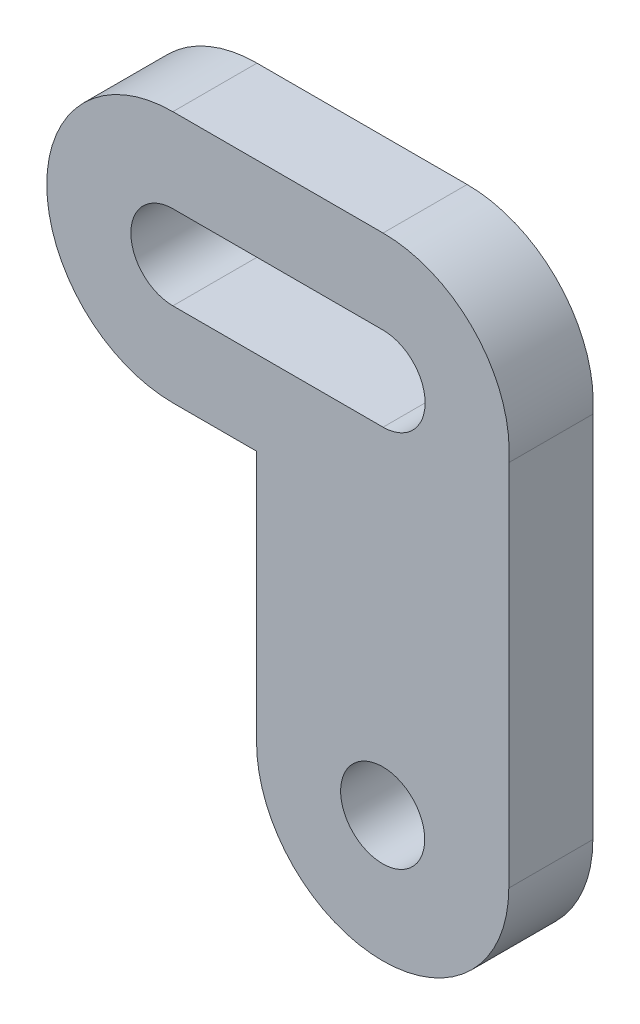
ISO-10303-21;
HEADER;
FILE_DESCRIPTION(('STEP AP214'),'2;1');
FILE_NAME('part.step','',(''),(''),'','','');
FILE_SCHEMA(('AUTOMOTIVE_DESIGN { 1 0 10303 214 1 1 1 1 }'));
ENDSEC;
DATA;
#1=APPLICATION_CONTEXT('core data for automotive mechanical design processes');
#2=APPLICATION_PROTOCOL_DEFINITION('international standard','automotive_design',2000,#1);
#3=PRODUCT_CONTEXT('',#1,'mechanical');
#4=PRODUCT('Part','Part','',(#3));
#5=PRODUCT_RELATED_PRODUCT_CATEGORY('part','',(#4));
#6=PRODUCT_DEFINITION_FORMATION('','',#4);
#7=PRODUCT_DEFINITION_CONTEXT('part definition',#1,'design');
#8=PRODUCT_DEFINITION('design','',#6,#7);
#9=PRODUCT_DEFINITION_SHAPE('','',#8);
#10=(LENGTH_UNIT() NAMED_UNIT(*) SI_UNIT(.MILLI.,.METRE.));
#11=(NAMED_UNIT(*) PLANE_ANGLE_UNIT() SI_UNIT($,.RADIAN.));
#12=(NAMED_UNIT(*) SI_UNIT($,.STERADIAN.) SOLID_ANGLE_UNIT());
#13=UNCERTAINTY_MEASURE_WITH_UNIT(LENGTH_MEASURE(1.E-05),#10,'distance_accuracy_value','');
#14=(GEOMETRIC_REPRESENTATION_CONTEXT(3) GLOBAL_UNCERTAINTY_ASSIGNED_CONTEXT((#13)) GLOBAL_UNIT_ASSIGNED_CONTEXT((#10,
#11,#12)) REPRESENTATION_CONTEXT('',''));
#15=CARTESIAN_POINT('',(0.,0.,0.));
#16=DIRECTION('',(0.,0.,1.));
#17=DIRECTION('',(1.,0.,0.));
#18=AXIS2_PLACEMENT_3D('',#15,#16,#17);
#19=CARTESIAN_POINT('',(156.2128865511,239.8700734832,3.));
#20=DIRECTION('',(0.,0.,-1.));
#21=DIRECTION('',(-1.,0.,0.));
#22=AXIS2_PLACEMENT_3D('',#19,#20,#21);
#23=CYLINDRICAL_SURFACE('',#22,1.5);
#24=CARTESIAN_POINT('',(156.2128865511,239.8700734832,0.));
#25=DIRECTION('',(0.,0.,1.));
#26=DIRECTION('',(1.,0.,0.));
#27=AXIS2_PLACEMENT_3D('',#24,#25,#26);
#28=CIRCLE('',#27,1.5);
#29=CARTESIAN_POINT('',(156.2128865511,238.3700734832,0.));
#30=VERTEX_POINT('',#29);
#31=CARTESIAN_POINT('',(156.2128865511,241.3700734832,0.));
#32=VERTEX_POINT('',#31);
#33=EDGE_CURVE('E172',#30,#32,#28,.T.);
#34=ORIENTED_EDGE('',*,*,#33,.F.);
#35=DIRECTION('',(0.,0.,-1.));
#36=VECTOR('',#35,1.);
#37=CARTESIAN_POINT('',(156.2128865511,238.3700734832,3.));
#38=LINE('',#37,#36);
#39=CARTESIAN_POINT('',(156.2128865511,238.3700734832,3.));
#40=VERTEX_POINT('',#39);
#41=EDGE_CURVE('E11',#40,#30,#38,.T.);
#42=ORIENTED_EDGE('',*,*,#41,.F.);
#43=CARTESIAN_POINT('',(156.2128865511,239.8700734832,3.));
#44=DIRECTION('',(0.,0.,1.));
#45=DIRECTION('',(1.,0.,0.));
#46=AXIS2_PLACEMENT_3D('',#43,#44,#45);
#47=CIRCLE('',#46,1.5);
#48=CARTESIAN_POINT('',(156.2128865511,241.3700734832,3.));
#49=VERTEX_POINT('',#48);
#50=EDGE_CURVE('E131',#40,#49,#47,.T.);
#51=ORIENTED_EDGE('',*,*,#50,.T.);
#52=DIRECTION('',(0.,0.,-1.));
#53=VECTOR('',#52,1.);
#54=CARTESIAN_POINT('',(156.2128865511,241.3700734832,3.));
#55=LINE('',#54,#53);
#56=EDGE_CURVE('E95',#49,#32,#55,.T.);
#57=ORIENTED_EDGE('',*,*,#56,.T.);
#58=EDGE_LOOP('',(#34,#42,#51,#57));
#59=FACE_BOUND('',#58,.T.);
#60=ADVANCED_FACE('F33',(#59),#23,.F.);
#61=CARTESIAN_POINT('',(0.,238.3700734832,3.));
#62=DIRECTION('',(0.,-1.,0.));
#63=DIRECTION('',(0.,0.,-1.));
#64=AXIS2_PLACEMENT_3D('',#61,#62,#63);
#65=PLANE('',#64);
#66=DIRECTION('',(-1.,0.,0.));
#67=VECTOR('',#66,1.);
#68=CARTESIAN_POINT('',(0.,238.3700734832,0.));
#69=LINE('',#68,#67);
#70=CARTESIAN_POINT('',(148.7128865511,238.3700734832,0.));
#71=VERTEX_POINT('',#70);
#72=EDGE_CURVE('E137',#30,#71,#69,.T.);
#73=ORIENTED_EDGE('',*,*,#72,.T.);
#74=DIRECTION('',(0.,0.,-1.));
#75=VECTOR('',#74,1.);
#76=CARTESIAN_POINT('',(148.7128865511,238.3700734832,3.));
#77=LINE('',#76,#75);
#78=CARTESIAN_POINT('',(148.7128865511,238.3700734832,3.));
#79=VERTEX_POINT('',#78);
#80=EDGE_CURVE('E43',#79,#71,#77,.T.);
#81=ORIENTED_EDGE('',*,*,#80,.F.);
#82=DIRECTION('',(-1.,0.,0.));
#83=VECTOR('',#82,1.);
#84=CARTESIAN_POINT('',(0.,238.3700734832,3.));
#85=LINE('',#84,#83);
#86=EDGE_CURVE('E125',#40,#79,#85,.T.);
#87=ORIENTED_EDGE('',*,*,#86,.F.);
#88=ORIENTED_EDGE('',*,*,#41,.T.);
#89=EDGE_LOOP('',(#73,#81,#87,#88));
#90=FACE_BOUND('',#89,.T.);
#91=ADVANCED_FACE('F135',(#90),#65,.F.);
#92=CARTESIAN_POINT('',(148.7128865511,239.8700734832,3.));
#93=DIRECTION('',(0.,0.,-1.));
#94=DIRECTION('',(-1.,0.,0.));
#95=AXIS2_PLACEMENT_3D('',#92,#93,#94);
#96=CYLINDRICAL_SURFACE('',#95,1.5);
#97=CARTESIAN_POINT('',(148.7128865511,239.8700734832,0.));
#98=DIRECTION('',(0.,0.,1.));
#99=DIRECTION('',(1.,0.,0.));
#100=AXIS2_PLACEMENT_3D('',#97,#98,#99);
#101=CIRCLE('',#100,1.5);
#102=CARTESIAN_POINT('',(148.7128865511,241.3700734832,0.));
#103=VERTEX_POINT('',#102);
#104=EDGE_CURVE('E176',#103,#71,#101,.T.);
#105=ORIENTED_EDGE('',*,*,#104,.F.);
#106=DIRECTION('',(0.,0.,-1.));
#107=VECTOR('',#106,1.);
#108=CARTESIAN_POINT('',(148.7128865511,241.3700734832,3.));
#109=LINE('',#108,#107);
#110=CARTESIAN_POINT('',(148.7128865511,241.3700734832,3.));
#111=VERTEX_POINT('',#110);
#112=EDGE_CURVE('E88',#111,#103,#109,.T.);
#113=ORIENTED_EDGE('',*,*,#112,.F.);
#114=CARTESIAN_POINT('',(148.7128865511,239.8700734832,3.));
#115=DIRECTION('',(0.,0.,1.));
#116=DIRECTION('',(1.,0.,0.));
#117=AXIS2_PLACEMENT_3D('',#114,#115,#116);
#118=CIRCLE('',#117,1.5);
#119=EDGE_CURVE('E130',#111,#79,#118,.T.);
#120=ORIENTED_EDGE('',*,*,#119,.T.);
#121=ORIENTED_EDGE('',*,*,#80,.T.);
#122=EDGE_LOOP('',(#105,#113,#120,#121));
#123=FACE_BOUND('',#122,.T.);
#124=ADVANCED_FACE('F142',(#123),#96,.F.);
#125=CARTESIAN_POINT('',(160.6989262173,0.,3.));
#126=DIRECTION('',(1.,0.,0.));
#127=DIRECTION('',(0.,0.,-1.));
#128=AXIS2_PLACEMENT_3D('',#125,#126,#127);
#129=PLANE('',#128);
#130=DIRECTION('',(0.,-1.,0.));
#131=VECTOR('',#130,1.);
#132=CARTESIAN_POINT('',(160.6989262173,0.,0.));
#133=LINE('',#132,#131);
#134=CARTESIAN_POINT('',(160.6989262173,239.515886931676,0.));
#135=VERTEX_POINT('',#134);
#136=CARTESIAN_POINT('',(160.6989262173,226.3700734832,0.));
#137=VERTEX_POINT('',#136);
#138=EDGE_CURVE('E151',#135,#137,#133,.T.);
#139=ORIENTED_EDGE('',*,*,#138,.F.);
#140=DIRECTION('',(0.,0.,-1.));
#141=VECTOR('',#140,1.);
#142=CARTESIAN_POINT('',(160.6989262173,239.515886931676,3.));
#143=LINE('',#142,#141);
#144=CARTESIAN_POINT('',(160.6989262173,239.515886931676,3.));
#145=VERTEX_POINT('',#144);
#146=EDGE_CURVE('E37',#145,#135,#143,.T.);
#147=ORIENTED_EDGE('',*,*,#146,.F.);
#148=DIRECTION('',(0.,-1.,0.));
#149=VECTOR('',#148,1.);
#150=CARTESIAN_POINT('',(160.6989262173,0.,3.));
#151=LINE('',#150,#149);
#152=CARTESIAN_POINT('',(160.6989262173,226.3700734832,3.));
#153=VERTEX_POINT('',#152);
#154=EDGE_CURVE('E183',#145,#153,#151,.T.);
#155=ORIENTED_EDGE('',*,*,#154,.T.);
#156=DIRECTION('',(0.,0.,-1.));
#157=VECTOR('',#156,1.);
#158=CARTESIAN_POINT('',(160.6989262173,226.3700734832,3.));
#159=LINE('',#158,#157);
#160=EDGE_CURVE('E150',#153,#137,#159,.T.);
#161=ORIENTED_EDGE('',*,*,#160,.T.);
#162=EDGE_LOOP('',(#139,#147,#155,#161));
#163=FACE_BOUND('',#162,.T.);
#164=ADVANCED_FACE('F35',(#163),#129,.T.);
#165=CARTESIAN_POINT('',(156.2128865511,239.8700734832,3.));
#166=DIRECTION('',(0.,0.,-1.));
#167=DIRECTION('',(-1.,0.,0.));
#168=AXIS2_PLACEMENT_3D('',#165,#166,#167);
#169=CYLINDRICAL_SURFACE('',#168,4.5);
#170=CARTESIAN_POINT('',(156.2128865511,239.8700734832,0.));
#171=DIRECTION('',(0.,0.,1.));
#172=DIRECTION('',(1.,0.,0.));
#173=AXIS2_PLACEMENT_3D('',#170,#171,#172);
#174=CIRCLE('',#173,4.5);
#175=CARTESIAN_POINT('',(156.2128865511,244.3700734832,0.));
#176=VERTEX_POINT('',#175);
#177=EDGE_CURVE('E154',#135,#176,#174,.T.);
#178=ORIENTED_EDGE('',*,*,#177,.T.);
#179=DIRECTION('',(0.,0.,-1.));
#180=VECTOR('',#179,1.);
#181=CARTESIAN_POINT('',(156.2128865511,244.3700734832,3.));
#182=LINE('',#181,#180);
#183=CARTESIAN_POINT('',(156.2128865511,244.3700734832,3.));
#184=VERTEX_POINT('',#183);
#185=EDGE_CURVE('E194',#184,#176,#182,.T.);
#186=ORIENTED_EDGE('',*,*,#185,.F.);
#187=CARTESIAN_POINT('',(156.2128865511,239.8700734832,3.));
#188=DIRECTION('',(0.,0.,1.));
#189=DIRECTION('',(1.,0.,0.));
#190=AXIS2_PLACEMENT_3D('',#187,#188,#189);
#191=CIRCLE('',#190,4.5);
#192=EDGE_CURVE('E202',#145,#184,#191,.T.);
#193=ORIENTED_EDGE('',*,*,#192,.F.);
#194=ORIENTED_EDGE('',*,*,#146,.T.);
#195=EDGE_LOOP('',(#178,#186,#193,#194));
#196=FACE_BOUND('',#195,.T.);
#197=ADVANCED_FACE('F201',(#196),#169,.T.);
#198=CARTESIAN_POINT('',(0.,244.3700734832,3.));
#199=DIRECTION('',(0.,1.,0.));
#200=DIRECTION('',(0.,0.,1.));
#201=AXIS2_PLACEMENT_3D('',#198,#199,#200);
#202=PLANE('',#201);
#203=DIRECTION('',(1.,0.,0.));
#204=VECTOR('',#203,1.);
#205=CARTESIAN_POINT('',(0.,244.3700734832,0.));
#206=LINE('',#205,#204);
#207=CARTESIAN_POINT('',(148.7128865511,244.3700734832,0.));
#208=VERTEX_POINT('',#207);
#209=EDGE_CURVE('E157',#208,#176,#206,.T.);
#210=ORIENTED_EDGE('',*,*,#209,.F.);
#211=DIRECTION('',(0.,0.,-1.));
#212=VECTOR('',#211,1.);
#213=CARTESIAN_POINT('',(148.7128865511,244.3700734832,3.));
#214=LINE('',#213,#212);
#215=CARTESIAN_POINT('',(148.7128865511,244.3700734832,3.));
#216=VERTEX_POINT('',#215);
#217=EDGE_CURVE('E193',#216,#208,#214,.T.);
#218=ORIENTED_EDGE('',*,*,#217,.F.);
#219=DIRECTION('',(1.,0.,0.));
#220=VECTOR('',#219,1.);
#221=CARTESIAN_POINT('',(0.,244.3700734832,3.));
#222=LINE('',#221,#220);
#223=EDGE_CURVE('E229',#216,#184,#222,.T.);
#224=ORIENTED_EDGE('',*,*,#223,.T.);
#225=ORIENTED_EDGE('',*,*,#185,.T.);
#226=EDGE_LOOP('',(#210,#218,#224,#225));
#227=FACE_BOUND('',#226,.T.);
#228=ADVANCED_FACE('F226',(#227),#202,.T.);
#229=CARTESIAN_POINT('',(148.7128865511,239.8700734832,3.));
#230=DIRECTION('',(0.,0.,-1.));
#231=DIRECTION('',(-1.,0.,0.));
#232=AXIS2_PLACEMENT_3D('',#229,#230,#231);
#233=CYLINDRICAL_SURFACE('',#232,4.49999999999999);
#234=CARTESIAN_POINT('',(148.7128865511,239.8700734832,0.));
#235=DIRECTION('',(0.,0.,1.));
#236=DIRECTION('',(1.,0.,0.));
#237=AXIS2_PLACEMENT_3D('',#234,#235,#236);
#238=CIRCLE('',#237,4.49999999999999);
#239=CARTESIAN_POINT('',(148.7128865511,235.3700734832,0.));
#240=VERTEX_POINT('',#239);
#241=EDGE_CURVE('E160',#208,#240,#238,.T.);
#242=ORIENTED_EDGE('',*,*,#241,.T.);
#243=DIRECTION('',(0.,0.,-1.));
#244=VECTOR('',#243,1.);
#245=CARTESIAN_POINT('',(148.7128865511,235.3700734832,3.));
#246=LINE('',#245,#244);
#247=CARTESIAN_POINT('',(148.7128865511,235.3700734832,3.));
#248=VERTEX_POINT('',#247);
#249=EDGE_CURVE('E191',#248,#240,#246,.T.);
#250=ORIENTED_EDGE('',*,*,#249,.F.);
#251=CARTESIAN_POINT('',(148.7128865511,239.8700734832,3.));
#252=DIRECTION('',(0.,0.,1.));
#253=DIRECTION('',(1.,0.,0.));
#254=AXIS2_PLACEMENT_3D('',#251,#252,#253);
#255=CIRCLE('',#254,4.49999999999999);
#256=EDGE_CURVE('E230',#216,#248,#255,.T.);
#257=ORIENTED_EDGE('',*,*,#256,.F.);
#258=ORIENTED_EDGE('',*,*,#217,.T.);
#259=EDGE_LOOP('',(#242,#250,#257,#258));
#260=FACE_BOUND('',#259,.T.);
#261=ADVANCED_FACE('F231',(#260),#233,.T.);
#262=CARTESIAN_POINT('',(0.,235.3700734832,3.));
#263=DIRECTION('',(0.,-1.,0.));
#264=DIRECTION('',(0.,0.,-1.));
#265=AXIS2_PLACEMENT_3D('',#262,#263,#264);
#266=PLANE('',#265);
#267=DIRECTION('',(-1.,0.,0.));
#268=VECTOR('',#267,1.);
#269=CARTESIAN_POINT('',(0.,235.3700734832,0.));
#270=LINE('',#269,#268);
#271=CARTESIAN_POINT('',(151.6989262173,235.3700734832,0.));
#272=VERTEX_POINT('',#271);
#273=EDGE_CURVE('E163',#272,#240,#270,.T.);
#274=ORIENTED_EDGE('',*,*,#273,.F.);
#275=DIRECTION('',(0.,0.,-1.));
#276=VECTOR('',#275,1.);
#277=CARTESIAN_POINT('',(151.6989262173,235.3700734832,3.));
#278=LINE('',#277,#276);
#279=CARTESIAN_POINT('',(151.6989262173,235.3700734832,3.));
#280=VERTEX_POINT('',#279);
#281=EDGE_CURVE('E189',#280,#272,#278,.T.);
#282=ORIENTED_EDGE('',*,*,#281,.F.);
#283=DIRECTION('',(-1.,0.,0.));
#284=VECTOR('',#283,1.);
#285=CARTESIAN_POINT('',(0.,235.3700734832,3.));
#286=LINE('',#285,#284);
#287=EDGE_CURVE('E233',#280,#248,#286,.T.);
#288=ORIENTED_EDGE('',*,*,#287,.T.);
#289=ORIENTED_EDGE('',*,*,#249,.T.);
#290=EDGE_LOOP('',(#274,#282,#288,#289));
#291=FACE_BOUND('',#290,.T.);
#292=ADVANCED_FACE('F223',(#291),#266,.T.);
#293=CARTESIAN_POINT('',(151.6989262173,0.,3.));
#294=DIRECTION('',(-1.,0.,0.));
#295=DIRECTION('',(0.,0.,1.));
#296=AXIS2_PLACEMENT_3D('',#293,#294,#295);
#297=PLANE('',#296);
#298=DIRECTION('',(0.,1.,0.));
#299=VECTOR('',#298,1.);
#300=CARTESIAN_POINT('',(151.6989262173,0.,0.));
#301=LINE('',#300,#299);
#302=CARTESIAN_POINT('',(151.6989262173,226.3700734832,0.));
#303=VERTEX_POINT('',#302);
#304=EDGE_CURVE('E166',#303,#272,#301,.T.);
#305=ORIENTED_EDGE('',*,*,#304,.F.);
#306=DIRECTION('',(0.,0.,-1.));
#307=VECTOR('',#306,1.);
#308=CARTESIAN_POINT('',(151.6989262173,226.3700734832,3.));
#309=LINE('',#308,#307);
#310=CARTESIAN_POINT('',(151.6989262173,226.3700734832,3.));
#311=VERTEX_POINT('',#310);
#312=EDGE_CURVE('E187',#311,#303,#309,.T.);
#313=ORIENTED_EDGE('',*,*,#312,.F.);
#314=DIRECTION('',(0.,1.,0.));
#315=VECTOR('',#314,1.);
#316=CARTESIAN_POINT('',(151.6989262173,0.,3.));
#317=LINE('',#316,#315);
#318=EDGE_CURVE('E219',#311,#280,#317,.T.);
#319=ORIENTED_EDGE('',*,*,#318,.T.);
#320=ORIENTED_EDGE('',*,*,#281,.T.);
#321=EDGE_LOOP('',(#305,#313,#319,#320));
#322=FACE_BOUND('',#321,.T.);
#323=ADVANCED_FACE('F215',(#322),#297,.T.);
#324=CARTESIAN_POINT('',(0.,241.3700734832,3.));
#325=DIRECTION('',(0.,1.,0.));
#326=DIRECTION('',(0.,0.,1.));
#327=AXIS2_PLACEMENT_3D('',#324,#325,#326);
#328=PLANE('',#327);
#329=DIRECTION('',(1.,0.,0.));
#330=VECTOR('',#329,1.);
#331=CARTESIAN_POINT('',(0.,241.3700734832,0.));
#332=LINE('',#331,#330);
#333=EDGE_CURVE('E178',#103,#32,#332,.T.);
#334=ORIENTED_EDGE('',*,*,#333,.T.);
#335=ORIENTED_EDGE('',*,*,#56,.F.);
#336=DIRECTION('',(1.,0.,0.));
#337=VECTOR('',#336,1.);
#338=CARTESIAN_POINT('',(0.,241.3700734832,3.));
#339=LINE('',#338,#337);
#340=EDGE_CURVE('E52',#111,#49,#339,.T.);
#341=ORIENTED_EDGE('',*,*,#340,.F.);
#342=ORIENTED_EDGE('',*,*,#112,.T.);
#343=EDGE_LOOP('',(#334,#335,#341,#342));
#344=FACE_BOUND('',#343,.T.);
#345=ADVANCED_FACE('F243',(#344),#328,.F.);
#346=CARTESIAN_POINT('',(156.1989262173,226.3700734832,3.));
#347=DIRECTION('',(0.,0.,-1.));
#348=DIRECTION('',(-1.,0.,0.));
#349=AXIS2_PLACEMENT_3D('',#346,#347,#348);
#350=CYLINDRICAL_SURFACE('',#349,4.5);
#351=CARTESIAN_POINT('',(156.1989262173,226.3700734832,0.));
#352=DIRECTION('',(0.,0.,1.));
#353=DIRECTION('',(1.,0.,0.));
#354=AXIS2_PLACEMENT_3D('',#351,#352,#353);
#355=CIRCLE('',#354,4.5);
#356=EDGE_CURVE('E169',#303,#137,#355,.T.);
#357=ORIENTED_EDGE('',*,*,#356,.T.);
#358=ORIENTED_EDGE('',*,*,#160,.F.);
#359=CARTESIAN_POINT('',(156.1989262173,226.3700734832,3.));
#360=DIRECTION('',(0.,0.,1.));
#361=DIRECTION('',(1.,0.,0.));
#362=AXIS2_PLACEMENT_3D('',#359,#360,#361);
#363=CIRCLE('',#362,4.5);
#364=EDGE_CURVE('E241',#311,#153,#363,.T.);
#365=ORIENTED_EDGE('',*,*,#364,.F.);
#366=ORIENTED_EDGE('',*,*,#312,.T.);
#367=EDGE_LOOP('',(#357,#358,#365,#366));
#368=FACE_BOUND('',#367,.T.);
#369=ADVANCED_FACE('F212',(#368),#350,.T.);
#370=CARTESIAN_POINT('',(156.1989262173,226.3700734832,3.));
#371=DIRECTION('',(0.,0.,-1.));
#372=DIRECTION('',(-1.,0.,0.));
#373=AXIS2_PLACEMENT_3D('',#370,#371,#372);
#374=CYLINDRICAL_SURFACE('',#373,1.5);
#375=CARTESIAN_POINT('',(156.1989262173,226.3700734832,3.));
#376=DIRECTION('',(0.,0.,1.));
#377=DIRECTION('',(1.,0.,0.));
#378=AXIS2_PLACEMENT_3D('',#375,#376,#377);
#379=CIRCLE('',#378,1.5);
#380=CARTESIAN_POINT('',(157.6989262173,226.3700734832,3.));
#381=VERTEX_POINT('',#380);
#382=EDGE_CURVE('E144',#381,#381,#379,.T.);
#383=ORIENTED_EDGE('',*,*,#382,.T.);
#384=EDGE_LOOP('',(#383));
#385=FACE_BOUND('',#384,.T.);
#386=CARTESIAN_POINT('',(156.1989262173,226.3700734832,0.));
#387=DIRECTION('',(0.,0.,1.));
#388=DIRECTION('',(1.,0.,0.));
#389=AXIS2_PLACEMENT_3D('',#386,#387,#388);
#390=CIRCLE('',#389,1.5);
#391=CARTESIAN_POINT('',(157.6989262173,226.3700734832,0.));
#392=VERTEX_POINT('',#391);
#393=EDGE_CURVE('E180',#392,#392,#390,.T.);
#394=ORIENTED_EDGE('',*,*,#393,.F.);
#395=EDGE_LOOP('',(#394));
#396=FACE_BOUND('',#395,.T.);
#397=ADVANCED_FACE('F250',(#385,#396),#374,.F.);
#398=CARTESIAN_POINT('',(0.,0.,3.));
#399=DIRECTION('',(0.,0.,1.));
#400=DIRECTION('',(1.,0.,0.));
#401=AXIS2_PLACEMENT_3D('',#398,#399,#400);
#402=PLANE('',#401);
#403=ORIENTED_EDGE('',*,*,#154,.F.);
#404=ORIENTED_EDGE('',*,*,#192,.T.);
#405=ORIENTED_EDGE('',*,*,#223,.F.);
#406=ORIENTED_EDGE('',*,*,#256,.T.);
#407=ORIENTED_EDGE('',*,*,#287,.F.);
#408=ORIENTED_EDGE('',*,*,#318,.F.);
#409=ORIENTED_EDGE('',*,*,#364,.T.);
#410=EDGE_LOOP('',(#403,#404,#405,#406,#407,#408,#409));
#411=FACE_BOUND('',#410,.T.);
#412=ORIENTED_EDGE('',*,*,#50,.F.);
#413=ORIENTED_EDGE('',*,*,#86,.T.);
#414=ORIENTED_EDGE('',*,*,#119,.F.);
#415=ORIENTED_EDGE('',*,*,#340,.T.);
#416=EDGE_LOOP('',(#412,#413,#414,#415));
#417=FACE_BOUND('',#416,.T.);
#418=ORIENTED_EDGE('',*,*,#382,.F.);
#419=EDGE_LOOP('',(#418));
#420=FACE_BOUND('',#419,.T.);
#421=ADVANCED_FACE('F127',(#411,#417,#420),#402,.T.);
#422=CARTESIAN_POINT('',(0.,0.,0.));
#423=DIRECTION('',(0.,0.,1.));
#424=DIRECTION('',(1.,0.,0.));
#425=AXIS2_PLACEMENT_3D('',#422,#423,#424);
#426=PLANE('',#425);
#427=ORIENTED_EDGE('',*,*,#138,.T.);
#428=ORIENTED_EDGE('',*,*,#356,.F.);
#429=ORIENTED_EDGE('',*,*,#304,.T.);
#430=ORIENTED_EDGE('',*,*,#273,.T.);
#431=ORIENTED_EDGE('',*,*,#241,.F.);
#432=ORIENTED_EDGE('',*,*,#209,.T.);
#433=ORIENTED_EDGE('',*,*,#177,.F.);
#434=EDGE_LOOP('',(#427,#428,#429,#430,#431,#432,#433));
#435=FACE_BOUND('',#434,.T.);
#436=ORIENTED_EDGE('',*,*,#33,.T.);
#437=ORIENTED_EDGE('',*,*,#333,.F.);
#438=ORIENTED_EDGE('',*,*,#104,.T.);
#439=ORIENTED_EDGE('',*,*,#72,.F.);
#440=EDGE_LOOP('',(#436,#437,#438,#439));
#441=FACE_BOUND('',#440,.T.);
#442=ORIENTED_EDGE('',*,*,#393,.T.);
#443=EDGE_LOOP('',(#442));
#444=FACE_BOUND('',#443,.T.);
#445=ADVANCED_FACE('F205',(#435,#441,#444),#426,.F.);
#446=CLOSED_SHELL('',(#60,#91,#124,#164,#197,#228,#261,#292,#323,#345,#369,#397,#421,#445));
#447=MANIFOLD_SOLID_BREP('B2',#446);
#448=ADVANCED_BREP_SHAPE_REPRESENTATION('',(#18,#447),#14);
#449=SHAPE_DEFINITION_REPRESENTATION(#9,#448);
ENDSEC;
END-ISO-10303-21;
